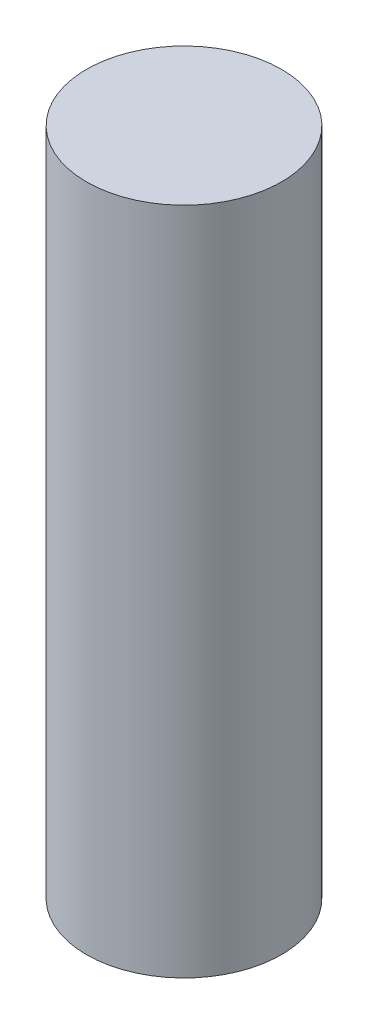
ISO-10303-21;
HEADER;
FILE_DESCRIPTION(('STEP AP214'),'2;1');
FILE_NAME('part.step','',(''),(''),'','','');
FILE_SCHEMA(('AUTOMOTIVE_DESIGN { 1 0 10303 214 1 1 1 1 }'));
ENDSEC;
DATA;
#1=APPLICATION_CONTEXT('core data for automotive mechanical design processes');
#2=APPLICATION_PROTOCOL_DEFINITION('international standard','automotive_design',2000,#1);
#3=PRODUCT_CONTEXT('',#1,'mechanical');
#4=PRODUCT('Part','Part','',(#3));
#5=PRODUCT_RELATED_PRODUCT_CATEGORY('part','',(#4));
#6=PRODUCT_DEFINITION_FORMATION('','',#4);
#7=PRODUCT_DEFINITION_CONTEXT('part definition',#1,'design');
#8=PRODUCT_DEFINITION('design','',#6,#7);
#9=PRODUCT_DEFINITION_SHAPE('','',#8);
#10=(LENGTH_UNIT() NAMED_UNIT(*) SI_UNIT(.MILLI.,.METRE.));
#11=(NAMED_UNIT(*) PLANE_ANGLE_UNIT() SI_UNIT($,.RADIAN.));
#12=(NAMED_UNIT(*) SI_UNIT($,.STERADIAN.) SOLID_ANGLE_UNIT());
#13=UNCERTAINTY_MEASURE_WITH_UNIT(LENGTH_MEASURE(1.E-05),#10,'distance_accuracy_value','');
#14=(GEOMETRIC_REPRESENTATION_CONTEXT(3) GLOBAL_UNCERTAINTY_ASSIGNED_CONTEXT((#13)) GLOBAL_UNIT_ASSIGNED_CONTEXT((#10,
#11,#12)) REPRESENTATION_CONTEXT('',''));
#15=CARTESIAN_POINT('',(0.,0.,0.));
#16=DIRECTION('',(0.,0.,1.));
#17=DIRECTION('',(1.,0.,0.));
#18=AXIS2_PLACEMENT_3D('',#15,#16,#17);
#19=CARTESIAN_POINT('',(0.,65.2,0.));
#20=DIRECTION('',(0.,-1.,0.));
#21=DIRECTION('',(0.,0.,-1.));
#22=AXIS2_PLACEMENT_3D('',#19,#20,#21);
#23=CYLINDRICAL_SURFACE('',#22,9.5);
#24=CARTESIAN_POINT('',(0.,65.2,0.));
#25=DIRECTION('',(0.,1.,0.));
#26=DIRECTION('',(0.,0.,1.));
#27=AXIS2_PLACEMENT_3D('',#24,#25,#26);
#28=CIRCLE('',#27,9.5);
#29=CARTESIAN_POINT('',(0.,65.2,9.5));
#30=VERTEX_POINT('',#29);
#31=EDGE_CURVE('E10',#30,#30,#28,.T.);
#32=ORIENTED_EDGE('',*,*,#31,.F.);
#33=EDGE_LOOP('',(#32));
#34=FACE_BOUND('',#33,.T.);
#35=CARTESIAN_POINT('',(0.,0.,0.));
#36=DIRECTION('',(0.,1.,0.));
#37=DIRECTION('',(0.,0.,1.));
#38=AXIS2_PLACEMENT_3D('',#35,#36,#37);
#39=CIRCLE('',#38,9.5);
#40=CARTESIAN_POINT('',(0.,0.,9.5));
#41=VERTEX_POINT('',#40);
#42=EDGE_CURVE('E34',#41,#41,#39,.T.);
#43=ORIENTED_EDGE('',*,*,#42,.T.);
#44=EDGE_LOOP('',(#43));
#45=FACE_BOUND('',#44,.T.);
#46=ADVANCED_FACE('F31',(#34,#45),#23,.T.);
#47=CARTESIAN_POINT('',(0.,65.2,0.));
#48=DIRECTION('',(0.,1.,0.));
#49=DIRECTION('',(0.,0.,1.));
#50=AXIS2_PLACEMENT_3D('',#47,#48,#49);
#51=PLANE('',#50);
#52=ORIENTED_EDGE('',*,*,#31,.T.);
#53=EDGE_LOOP('',(#52));
#54=FACE_BOUND('',#53,.T.);
#55=ADVANCED_FACE('F46',(#54),#51,.T.);
#56=CARTESIAN_POINT('',(0.,0.,0.));
#57=DIRECTION('',(0.,1.,0.));
#58=DIRECTION('',(0.,0.,1.));
#59=AXIS2_PLACEMENT_3D('',#56,#57,#58);
#60=PLANE('',#59);
#61=ORIENTED_EDGE('',*,*,#42,.F.);
#62=EDGE_LOOP('',(#61));
#63=FACE_BOUND('',#62,.T.);
#64=ADVANCED_FACE('F44',(#63),#60,.F.);
#65=CLOSED_SHELL('',(#46,#55,#64));
#66=MANIFOLD_SOLID_BREP('B2',#65);
#67=ADVANCED_BREP_SHAPE_REPRESENTATION('',(#18,#66),#14);
#68=SHAPE_DEFINITION_REPRESENTATION(#9,#67);
ENDSEC;
END-ISO-10303-21;
